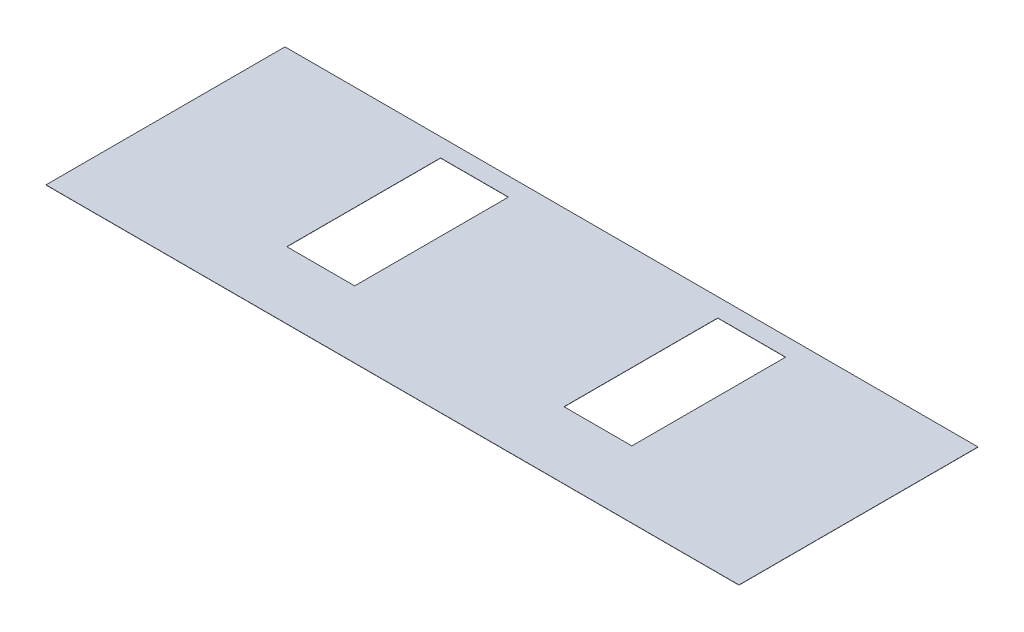
ISO-10303-21;
HEADER;
FILE_DESCRIPTION(('STEP AP214'),'2;1');
FILE_NAME('part.step','',(''),(''),'','','');
FILE_SCHEMA(('AUTOMOTIVE_DESIGN { 1 0 10303 214 1 1 1 1 }'));
ENDSEC;
DATA;
#1=APPLICATION_CONTEXT('core data for automotive mechanical design processes');
#2=APPLICATION_PROTOCOL_DEFINITION('international standard','automotive_design',2000,#1);
#3=PRODUCT_CONTEXT('',#1,'mechanical');
#4=PRODUCT('Part','Part','',(#3));
#5=PRODUCT_RELATED_PRODUCT_CATEGORY('part','',(#4));
#6=PRODUCT_DEFINITION_FORMATION('','',#4);
#7=PRODUCT_DEFINITION_CONTEXT('part definition',#1,'design');
#8=PRODUCT_DEFINITION('design','',#6,#7);
#9=PRODUCT_DEFINITION_SHAPE('','',#8);
#10=(LENGTH_UNIT() NAMED_UNIT(*) SI_UNIT(.MILLI.,.METRE.));
#11=(NAMED_UNIT(*) PLANE_ANGLE_UNIT() SI_UNIT($,.RADIAN.));
#12=(NAMED_UNIT(*) SI_UNIT($,.STERADIAN.) SOLID_ANGLE_UNIT());
#13=UNCERTAINTY_MEASURE_WITH_UNIT(LENGTH_MEASURE(1.E-05),#10,'distance_accuracy_value','');
#14=(GEOMETRIC_REPRESENTATION_CONTEXT(3) GLOBAL_UNCERTAINTY_ASSIGNED_CONTEXT((#13)) GLOBAL_UNIT_ASSIGNED_CONTEXT((#10,
#11,#12)) REPRESENTATION_CONTEXT('',''));
#15=CARTESIAN_POINT('',(0.,0.,0.));
#16=DIRECTION('',(0.,0.,1.));
#17=DIRECTION('',(1.,0.,0.));
#18=AXIS2_PLACEMENT_3D('',#15,#16,#17);
#19=CARTESIAN_POINT('',(3048.,1.5875,1051.306));
#20=DIRECTION('',(-1.,0.,0.));
#21=DIRECTION('',(0.,0.,1.));
#22=AXIS2_PLACEMENT_3D('',#19,#20,#21);
#23=PLANE('',#22);
#24=DIRECTION('',(0.,0.,-1.));
#25=VECTOR('',#24,1.);
#26=CARTESIAN_POINT('',(3048.,0.,1051.306));
#27=LINE('',#26,#25);
#28=CARTESIAN_POINT('',(3048.,0.,1051.306));
#29=VERTEX_POINT('',#28);
#30=CARTESIAN_POINT('',(3048.,0.,-1051.306));
#31=VERTEX_POINT('',#30);
#32=EDGE_CURVE('E202',#29,#31,#27,.T.);
#33=ORIENTED_EDGE('',*,*,#32,.T.);
#34=DIRECTION('',(0.,-1.,0.));
#35=VECTOR('',#34,1.);
#36=CARTESIAN_POINT('',(3048.,1.5875,-1051.306));
#37=LINE('',#36,#35);
#38=CARTESIAN_POINT('',(3048.,1.5875,-1051.306));
#39=VERTEX_POINT('',#38);
#40=EDGE_CURVE('E11',#39,#31,#37,.T.);
#41=ORIENTED_EDGE('',*,*,#40,.F.);
#42=DIRECTION('',(0.,0.,-1.));
#43=VECTOR('',#42,1.);
#44=CARTESIAN_POINT('',(3048.,1.5875,1051.306));
#45=LINE('',#44,#43);
#46=CARTESIAN_POINT('',(3048.,1.5875,1051.306));
#47=VERTEX_POINT('',#46);
#48=EDGE_CURVE('E203',#47,#39,#45,.T.);
#49=ORIENTED_EDGE('',*,*,#48,.F.);
#50=DIRECTION('',(0.,-1.,0.));
#51=VECTOR('',#50,1.);
#52=CARTESIAN_POINT('',(3048.,1.5875,1051.306));
#53=LINE('',#52,#51);
#54=EDGE_CURVE('E213',#47,#29,#53,.T.);
#55=ORIENTED_EDGE('',*,*,#54,.T.);
#56=EDGE_LOOP('',(#33,#41,#49,#55));
#57=FACE_BOUND('',#56,.T.);
#58=ADVANCED_FACE('F39',(#57),#23,.F.);
#59=CARTESIAN_POINT('',(-3048.,1.5875,-1051.306));
#60=DIRECTION('',(0.,0.,1.));
#61=DIRECTION('',(1.,0.,0.));
#62=AXIS2_PLACEMENT_3D('',#59,#60,#61);
#63=PLANE('',#62);
#64=DIRECTION('',(-1.,0.,0.));
#65=VECTOR('',#64,1.);
#66=CARTESIAN_POINT('',(-3048.,0.,-1051.306));
#67=LINE('',#66,#65);
#68=CARTESIAN_POINT('',(-3048.,0.,-1051.306));
#69=VERTEX_POINT('',#68);
#70=EDGE_CURVE('E216',#31,#69,#67,.T.);
#71=ORIENTED_EDGE('',*,*,#70,.T.);
#72=DIRECTION('',(0.,-1.,0.));
#73=VECTOR('',#72,1.);
#74=CARTESIAN_POINT('',(-3048.,1.5875,-1051.306));
#75=LINE('',#74,#73);
#76=CARTESIAN_POINT('',(-3048.,1.5875,-1051.306));
#77=VERTEX_POINT('',#76);
#78=EDGE_CURVE('E46',#77,#69,#75,.T.);
#79=ORIENTED_EDGE('',*,*,#78,.F.);
#80=DIRECTION('',(-1.,0.,0.));
#81=VECTOR('',#80,1.);
#82=CARTESIAN_POINT('',(-3048.,1.5875,-1051.306));
#83=LINE('',#82,#81);
#84=EDGE_CURVE('E206',#39,#77,#83,.T.);
#85=ORIENTED_EDGE('',*,*,#84,.F.);
#86=ORIENTED_EDGE('',*,*,#40,.T.);
#87=EDGE_LOOP('',(#71,#79,#85,#86));
#88=FACE_BOUND('',#87,.T.);
#89=ADVANCED_FACE('F245',(#88),#63,.F.);
#90=CARTESIAN_POINT('',(-3048.,1.5875,1051.306));
#91=DIRECTION('',(1.,0.,0.));
#92=DIRECTION('',(0.,0.,-1.));
#93=AXIS2_PLACEMENT_3D('',#90,#91,#92);
#94=PLANE('',#93);
#95=DIRECTION('',(0.,0.,1.));
#96=VECTOR('',#95,1.);
#97=CARTESIAN_POINT('',(-3048.,0.,1051.306));
#98=LINE('',#97,#96);
#99=CARTESIAN_POINT('',(-3048.,0.,1051.306));
#100=VERTEX_POINT('',#99);
#101=EDGE_CURVE('E218',#69,#100,#98,.T.);
#102=ORIENTED_EDGE('',*,*,#101,.T.);
#103=DIRECTION('',(0.,-1.,0.));
#104=VECTOR('',#103,1.);
#105=CARTESIAN_POINT('',(-3048.,1.5875,1051.306));
#106=LINE('',#105,#104);
#107=CARTESIAN_POINT('',(-3048.,1.5875,1051.306));
#108=VERTEX_POINT('',#107);
#109=EDGE_CURVE('E223',#108,#100,#106,.T.);
#110=ORIENTED_EDGE('',*,*,#109,.F.);
#111=DIRECTION('',(0.,0.,1.));
#112=VECTOR('',#111,1.);
#113=CARTESIAN_POINT('',(-3048.,1.5875,1051.306));
#114=LINE('',#113,#112);
#115=EDGE_CURVE('E209',#77,#108,#114,.T.);
#116=ORIENTED_EDGE('',*,*,#115,.F.);
#117=ORIENTED_EDGE('',*,*,#78,.T.);
#118=EDGE_LOOP('',(#102,#110,#116,#117));
#119=FACE_BOUND('',#118,.T.);
#120=ADVANCED_FACE('F230',(#119),#94,.F.);
#121=CARTESIAN_POINT('',(-3048.,1.5875,1051.306));
#122=DIRECTION('',(0.,0.,-1.));
#123=DIRECTION('',(-1.,0.,0.));
#124=AXIS2_PLACEMENT_3D('',#121,#122,#123);
#125=PLANE('',#124);
#126=DIRECTION('',(1.,0.,0.));
#127=VECTOR('',#126,1.);
#128=CARTESIAN_POINT('',(-3048.,0.,1051.306));
#129=LINE('',#128,#127);
#130=EDGE_CURVE('E207',#100,#29,#129,.T.);
#131=ORIENTED_EDGE('',*,*,#130,.T.);
#132=ORIENTED_EDGE('',*,*,#54,.F.);
#133=DIRECTION('',(1.,0.,0.));
#134=VECTOR('',#133,1.);
#135=CARTESIAN_POINT('',(-3048.,1.5875,1051.306));
#136=LINE('',#135,#134);
#137=EDGE_CURVE('E211',#108,#47,#136,.T.);
#138=ORIENTED_EDGE('',*,*,#137,.F.);
#139=ORIENTED_EDGE('',*,*,#109,.T.);
#140=EDGE_LOOP('',(#131,#132,#138,#139));
#141=FACE_BOUND('',#140,.T.);
#142=ADVANCED_FACE('F238',(#141),#125,.F.);
#143=CARTESIAN_POINT('',(0.,1.5875,0.));
#144=DIRECTION('',(0.,-1.,0.));
#145=DIRECTION('',(0.,0.,-1.));
#146=AXIS2_PLACEMENT_3D('',#143,#144,#145);
#147=PLANE('',#146);
#148=DIRECTION('',(1.,0.,0.));
#149=VECTOR('',#148,1.);
#150=CARTESIAN_POINT('',(0.,1.5875,-889.381));
#151=LINE('',#150,#149);
#152=CARTESIAN_POINT('',(-1517.65,1.5875,-889.381));
#153=VERTEX_POINT('',#152);
#154=CARTESIAN_POINT('',(-920.75,1.5875,-889.381));
#155=VERTEX_POINT('',#154);
#156=EDGE_CURVE('E193',#153,#155,#151,.T.);
#157=ORIENTED_EDGE('',*,*,#156,.T.);
#158=DIRECTION('',(0.,0.,1.));
#159=VECTOR('',#158,1.);
#160=CARTESIAN_POINT('',(-920.75,1.5875,0.));
#161=LINE('',#160,#159);
#162=CARTESIAN_POINT('',(-920.75,1.5875,463.169));
#163=VERTEX_POINT('',#162);
#164=EDGE_CURVE('E132',#155,#163,#161,.T.);
#165=ORIENTED_EDGE('',*,*,#164,.T.);
#166=DIRECTION('',(-1.,0.,0.));
#167=VECTOR('',#166,1.);
#168=CARTESIAN_POINT('',(0.,1.5875,463.169));
#169=LINE('',#168,#167);
#170=CARTESIAN_POINT('',(-1517.65,1.5875,463.169));
#171=VERTEX_POINT('',#170);
#172=EDGE_CURVE('E198',#163,#171,#169,.T.);
#173=ORIENTED_EDGE('',*,*,#172,.T.);
#174=DIRECTION('',(0.,0.,-1.));
#175=VECTOR('',#174,1.);
#176=CARTESIAN_POINT('',(-1517.65,1.5875,0.));
#177=LINE('',#176,#175);
#178=EDGE_CURVE('E195',#171,#153,#177,.T.);
#179=ORIENTED_EDGE('',*,*,#178,.T.);
#180=EDGE_LOOP('',(#157,#165,#173,#179));
#181=FACE_BOUND('',#180,.T.);
#182=DIRECTION('',(1.,0.,0.));
#183=VECTOR('',#182,1.);
#184=CARTESIAN_POINT('',(0.,1.5875,-889.381));
#185=LINE('',#184,#183);
#186=CARTESIAN_POINT('',(920.75,1.5875,-889.381));
#187=VERTEX_POINT('',#186);
#188=CARTESIAN_POINT('',(1517.65,1.5875,-889.381));
#189=VERTEX_POINT('',#188);
#190=EDGE_CURVE('E159',#187,#189,#185,.T.);
#191=ORIENTED_EDGE('',*,*,#190,.T.);
#192=DIRECTION('',(0.,0.,1.));
#193=VECTOR('',#192,1.);
#194=CARTESIAN_POINT('',(1517.65,1.5875,-2.4914864120696E-13));
#195=LINE('',#194,#193);
#196=CARTESIAN_POINT('',(1517.65,1.5875,463.169));
#197=VERTEX_POINT('',#196);
#198=EDGE_CURVE('E190',#189,#197,#195,.T.);
#199=ORIENTED_EDGE('',*,*,#198,.T.);
#200=DIRECTION('',(-1.,0.,0.));
#201=VECTOR('',#200,1.);
#202=CARTESIAN_POINT('',(0.,1.5875,463.169));
#203=LINE('',#202,#201);
#204=CARTESIAN_POINT('',(920.750000000001,1.5875,463.169));
#205=VERTEX_POINT('',#204);
#206=EDGE_CURVE('E187',#197,#205,#203,.T.);
#207=ORIENTED_EDGE('',*,*,#206,.T.);
#208=DIRECTION('',(0.,0.,-1.));
#209=VECTOR('',#208,1.);
#210=CARTESIAN_POINT('',(920.750000000001,1.5875,0.));
#211=LINE('',#210,#209);
#212=EDGE_CURVE('E184',#205,#187,#211,.T.);
#213=ORIENTED_EDGE('',*,*,#212,.T.);
#214=EDGE_LOOP('',(#191,#199,#207,#213));
#215=FACE_BOUND('',#214,.T.);
#216=ORIENTED_EDGE('',*,*,#48,.T.);
#217=ORIENTED_EDGE('',*,*,#84,.T.);
#218=ORIENTED_EDGE('',*,*,#115,.T.);
#219=ORIENTED_EDGE('',*,*,#137,.T.);
#220=EDGE_LOOP('',(#216,#217,#218,#219));
#221=FACE_BOUND('',#220,.T.);
#222=ADVANCED_FACE('F244',(#181,#215,#221),#147,.F.);
#223=CARTESIAN_POINT('',(0.,0.,0.));
#224=DIRECTION('',(0.,-1.,0.));
#225=DIRECTION('',(0.,0.,-1.));
#226=AXIS2_PLACEMENT_3D('',#223,#224,#225);
#227=PLANE('',#226);
#228=DIRECTION('',(0.,0.,-1.));
#229=VECTOR('',#228,1.);
#230=CARTESIAN_POINT('',(-920.75,0.,-889.381));
#231=LINE('',#230,#229);
#232=CARTESIAN_POINT('',(-920.75,0.,463.169));
#233=VERTEX_POINT('',#232);
#234=CARTESIAN_POINT('',(-920.75,0.,-889.381));
#235=VERTEX_POINT('',#234);
#236=EDGE_CURVE('E129',#233,#235,#231,.T.);
#237=ORIENTED_EDGE('',*,*,#236,.T.);
#238=DIRECTION('',(-1.,0.,0.));
#239=VECTOR('',#238,1.);
#240=CARTESIAN_POINT('',(-1517.65,0.,-889.381));
#241=LINE('',#240,#239);
#242=CARTESIAN_POINT('',(-1517.65,0.,-889.381));
#243=VERTEX_POINT('',#242);
#244=EDGE_CURVE('E139',#235,#243,#241,.T.);
#245=ORIENTED_EDGE('',*,*,#244,.T.);
#246=DIRECTION('',(0.,0.,1.));
#247=VECTOR('',#246,1.);
#248=CARTESIAN_POINT('',(-1517.65,0.,-889.381));
#249=LINE('',#248,#247);
#250=CARTESIAN_POINT('',(-1517.65,0.,463.169));
#251=VERTEX_POINT('',#250);
#252=EDGE_CURVE('E144',#243,#251,#249,.T.);
#253=ORIENTED_EDGE('',*,*,#252,.T.);
#254=DIRECTION('',(1.,0.,0.));
#255=VECTOR('',#254,1.);
#256=CARTESIAN_POINT('',(-1517.65,0.,463.169));
#257=LINE('',#256,#255);
#258=EDGE_CURVE('E135',#251,#233,#257,.T.);
#259=ORIENTED_EDGE('',*,*,#258,.T.);
#260=EDGE_LOOP('',(#237,#245,#253,#259));
#261=FACE_BOUND('',#260,.T.);
#262=DIRECTION('',(0.,0.,-1.));
#263=VECTOR('',#262,1.);
#264=CARTESIAN_POINT('',(1517.65,0.,-889.381));
#265=LINE('',#264,#263);
#266=CARTESIAN_POINT('',(1517.65,0.,463.169));
#267=VERTEX_POINT('',#266);
#268=CARTESIAN_POINT('',(1517.65,0.,-889.381));
#269=VERTEX_POINT('',#268);
#270=EDGE_CURVE('E149',#267,#269,#265,.T.);
#271=ORIENTED_EDGE('',*,*,#270,.T.);
#272=DIRECTION('',(-1.,0.,0.));
#273=VECTOR('',#272,1.);
#274=CARTESIAN_POINT('',(920.75,0.,-889.381));
#275=LINE('',#274,#273);
#276=CARTESIAN_POINT('',(920.75,0.,-889.381));
#277=VERTEX_POINT('',#276);
#278=EDGE_CURVE('E152',#269,#277,#275,.T.);
#279=ORIENTED_EDGE('',*,*,#278,.T.);
#280=DIRECTION('',(0.,0.,1.));
#281=VECTOR('',#280,1.);
#282=CARTESIAN_POINT('',(920.75,0.,-889.381));
#283=LINE('',#282,#281);
#284=CARTESIAN_POINT('',(920.750000000001,0.,463.169));
#285=VERTEX_POINT('',#284);
#286=EDGE_CURVE('E177',#277,#285,#283,.T.);
#287=ORIENTED_EDGE('',*,*,#286,.T.);
#288=DIRECTION('',(1.,0.,0.));
#289=VECTOR('',#288,1.);
#290=CARTESIAN_POINT('',(920.750000000001,0.,463.169));
#291=LINE('',#290,#289);
#292=EDGE_CURVE('E165',#285,#267,#291,.T.);
#293=ORIENTED_EDGE('',*,*,#292,.T.);
#294=EDGE_LOOP('',(#271,#279,#287,#293));
#295=FACE_BOUND('',#294,.T.);
#296=ORIENTED_EDGE('',*,*,#32,.F.);
#297=ORIENTED_EDGE('',*,*,#130,.F.);
#298=ORIENTED_EDGE('',*,*,#101,.F.);
#299=ORIENTED_EDGE('',*,*,#70,.F.);
#300=EDGE_LOOP('',(#296,#297,#298,#299));
#301=FACE_BOUND('',#300,.T.);
#302=ADVANCED_FACE('F146',(#261,#295,#301),#227,.T.);
#303=CARTESIAN_POINT('',(1517.65,0.,-889.381));
#304=DIRECTION('',(1.,0.,0.));
#305=DIRECTION('',(0.,0.,-1.));
#306=AXIS2_PLACEMENT_3D('',#303,#304,#305);
#307=PLANE('',#306);
#308=DIRECTION('',(0.,1.,0.));
#309=VECTOR('',#308,1.);
#310=CARTESIAN_POINT('',(1517.65,0.,-889.381));
#311=LINE('',#310,#309);
#312=EDGE_CURVE('E61',#269,#189,#311,.T.);
#313=ORIENTED_EDGE('',*,*,#312,.F.);
#314=ORIENTED_EDGE('',*,*,#270,.F.);
#315=DIRECTION('',(0.,1.,0.));
#316=VECTOR('',#315,1.);
#317=CARTESIAN_POINT('',(1517.65,0.,463.169));
#318=LINE('',#317,#316);
#319=EDGE_CURVE('E172',#267,#197,#318,.T.);
#320=ORIENTED_EDGE('',*,*,#319,.T.);
#321=ORIENTED_EDGE('',*,*,#198,.F.);
#322=EDGE_LOOP('',(#313,#314,#320,#321));
#323=FACE_BOUND('',#322,.T.);
#324=ADVANCED_FACE('F257',(#323),#307,.F.);
#325=CARTESIAN_POINT('',(920.750000000001,0.,463.169));
#326=DIRECTION('',(0.,0.,1.));
#327=DIRECTION('',(1.,0.,0.));
#328=AXIS2_PLACEMENT_3D('',#325,#326,#327);
#329=PLANE('',#328);
#330=ORIENTED_EDGE('',*,*,#319,.F.);
#331=ORIENTED_EDGE('',*,*,#292,.F.);
#332=DIRECTION('',(0.,1.,0.));
#333=VECTOR('',#332,1.);
#334=CARTESIAN_POINT('',(920.750000000001,0.,463.169));
#335=LINE('',#334,#333);
#336=EDGE_CURVE('E169',#285,#205,#335,.T.);
#337=ORIENTED_EDGE('',*,*,#336,.T.);
#338=ORIENTED_EDGE('',*,*,#206,.F.);
#339=EDGE_LOOP('',(#330,#331,#337,#338));
#340=FACE_BOUND('',#339,.T.);
#341=ADVANCED_FACE('F261',(#340),#329,.F.);
#342=CARTESIAN_POINT('',(920.75,0.,-889.381));
#343=DIRECTION('',(-1.,0.,0.));
#344=DIRECTION('',(0.,0.,1.));
#345=AXIS2_PLACEMENT_3D('',#342,#343,#344);
#346=PLANE('',#345);
#347=ORIENTED_EDGE('',*,*,#336,.F.);
#348=ORIENTED_EDGE('',*,*,#286,.F.);
#349=DIRECTION('',(0.,1.,0.));
#350=VECTOR('',#349,1.);
#351=CARTESIAN_POINT('',(920.75,0.,-889.381));
#352=LINE('',#351,#350);
#353=EDGE_CURVE('E166',#277,#187,#352,.T.);
#354=ORIENTED_EDGE('',*,*,#353,.T.);
#355=ORIENTED_EDGE('',*,*,#212,.F.);
#356=EDGE_LOOP('',(#347,#348,#354,#355));
#357=FACE_BOUND('',#356,.T.);
#358=ADVANCED_FACE('F264',(#357),#346,.F.);
#359=CARTESIAN_POINT('',(920.75,0.,-889.381));
#360=DIRECTION('',(0.,0.,-1.));
#361=DIRECTION('',(-1.,0.,0.));
#362=AXIS2_PLACEMENT_3D('',#359,#360,#361);
#363=PLANE('',#362);
#364=ORIENTED_EDGE('',*,*,#353,.F.);
#365=ORIENTED_EDGE('',*,*,#278,.F.);
#366=ORIENTED_EDGE('',*,*,#312,.T.);
#367=ORIENTED_EDGE('',*,*,#190,.F.);
#368=EDGE_LOOP('',(#364,#365,#366,#367));
#369=FACE_BOUND('',#368,.T.);
#370=ADVANCED_FACE('F268',(#369),#363,.F.);
#371=CARTESIAN_POINT('',(-920.75,0.,-889.381));
#372=DIRECTION('',(1.,0.,0.));
#373=DIRECTION('',(0.,0.,-1.));
#374=AXIS2_PLACEMENT_3D('',#371,#372,#373);
#375=PLANE('',#374);
#376=DIRECTION('',(0.,1.,0.));
#377=VECTOR('',#376,1.);
#378=CARTESIAN_POINT('',(-920.75,0.,-889.381));
#379=LINE('',#378,#377);
#380=EDGE_CURVE('E53',#235,#155,#379,.T.);
#381=ORIENTED_EDGE('',*,*,#380,.F.);
#382=ORIENTED_EDGE('',*,*,#236,.F.);
#383=DIRECTION('',(0.,1.,0.));
#384=VECTOR('',#383,1.);
#385=CARTESIAN_POINT('',(-920.75,0.,463.169));
#386=LINE('',#385,#384);
#387=EDGE_CURVE('E157',#233,#163,#386,.T.);
#388=ORIENTED_EDGE('',*,*,#387,.T.);
#389=ORIENTED_EDGE('',*,*,#164,.F.);
#390=EDGE_LOOP('',(#381,#382,#388,#389));
#391=FACE_BOUND('',#390,.T.);
#392=ADVANCED_FACE('F126',(#391),#375,.F.);
#393=CARTESIAN_POINT('',(-1517.65,0.,463.169));
#394=DIRECTION('',(0.,0.,1.));
#395=DIRECTION('',(1.,0.,0.));
#396=AXIS2_PLACEMENT_3D('',#393,#394,#395);
#397=PLANE('',#396);
#398=ORIENTED_EDGE('',*,*,#387,.F.);
#399=ORIENTED_EDGE('',*,*,#258,.F.);
#400=DIRECTION('',(0.,1.,0.));
#401=VECTOR('',#400,1.);
#402=CARTESIAN_POINT('',(-1517.65,0.,463.169));
#403=LINE('',#402,#401);
#404=EDGE_CURVE('E160',#251,#171,#403,.T.);
#405=ORIENTED_EDGE('',*,*,#404,.T.);
#406=ORIENTED_EDGE('',*,*,#172,.F.);
#407=EDGE_LOOP('',(#398,#399,#405,#406));
#408=FACE_BOUND('',#407,.T.);
#409=ADVANCED_FACE('F277',(#408),#397,.F.);
#410=CARTESIAN_POINT('',(-1517.65,0.,-889.381));
#411=DIRECTION('',(-1.,0.,0.));
#412=DIRECTION('',(0.,0.,1.));
#413=AXIS2_PLACEMENT_3D('',#410,#411,#412);
#414=PLANE('',#413);
#415=ORIENTED_EDGE('',*,*,#404,.F.);
#416=ORIENTED_EDGE('',*,*,#252,.F.);
#417=DIRECTION('',(0.,1.,0.));
#418=VECTOR('',#417,1.);
#419=CARTESIAN_POINT('',(-1517.65,0.,-889.381));
#420=LINE('',#419,#418);
#421=EDGE_CURVE('E134',#243,#153,#420,.T.);
#422=ORIENTED_EDGE('',*,*,#421,.T.);
#423=ORIENTED_EDGE('',*,*,#178,.F.);
#424=EDGE_LOOP('',(#415,#416,#422,#423));
#425=FACE_BOUND('',#424,.T.);
#426=ADVANCED_FACE('F280',(#425),#414,.F.);
#427=CARTESIAN_POINT('',(-1517.65,0.,-889.381));
#428=DIRECTION('',(0.,0.,-1.));
#429=DIRECTION('',(-1.,0.,0.));
#430=AXIS2_PLACEMENT_3D('',#427,#428,#429);
#431=PLANE('',#430);
#432=ORIENTED_EDGE('',*,*,#421,.F.);
#433=ORIENTED_EDGE('',*,*,#244,.F.);
#434=ORIENTED_EDGE('',*,*,#380,.T.);
#435=ORIENTED_EDGE('',*,*,#156,.F.);
#436=EDGE_LOOP('',(#432,#433,#434,#435));
#437=FACE_BOUND('',#436,.T.);
#438=ADVANCED_FACE('F140',(#437),#431,.F.);
#439=CLOSED_SHELL('',(#58,#89,#120,#142,#222,#302,#324,#341,#358,#370,#392,#409,#426,#438));
#440=MANIFOLD_SOLID_BREP('B2',#439);
#441=ADVANCED_BREP_SHAPE_REPRESENTATION('',(#18,#440),#14);
#442=SHAPE_DEFINITION_REPRESENTATION(#9,#441);
ENDSEC;
END-ISO-10303-21;
